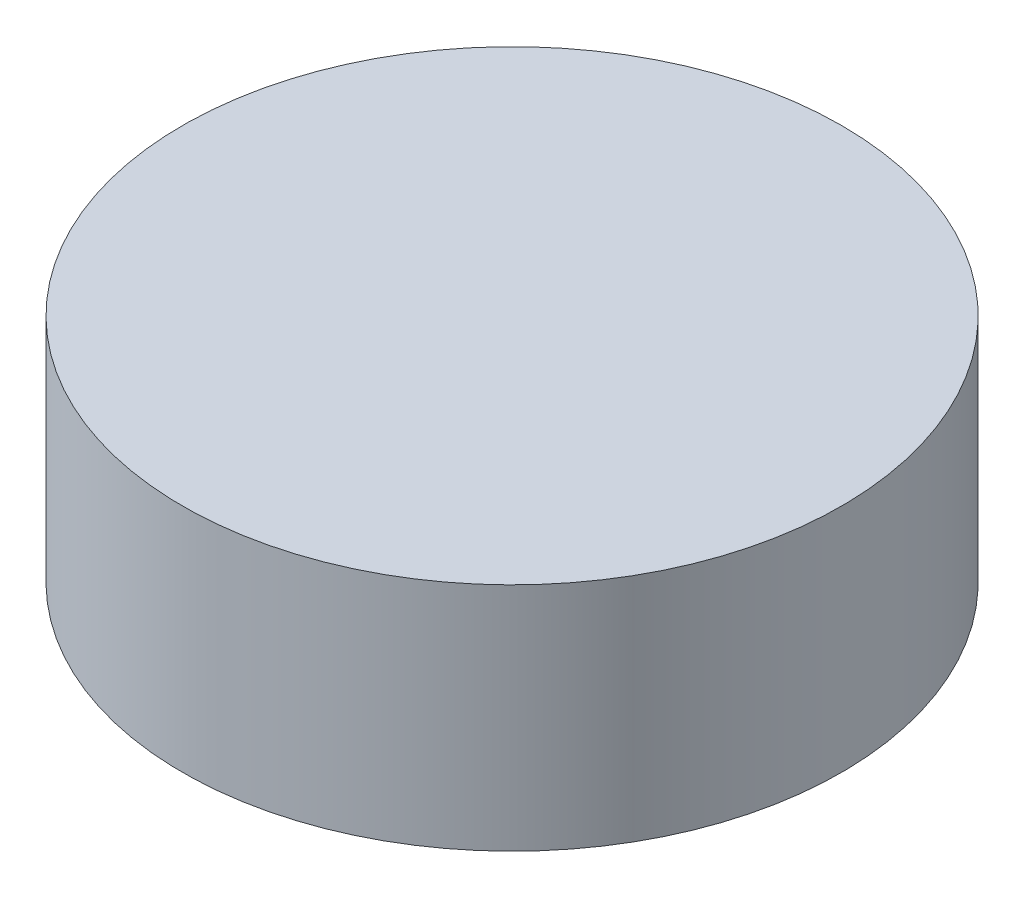
ISO-10303-21;
HEADER;
FILE_DESCRIPTION(('STEP AP214'),'2;1');
FILE_NAME('part.step','',(''),(''),'','','');
FILE_SCHEMA(('AUTOMOTIVE_DESIGN { 1 0 10303 214 1 1 1 1 }'));
ENDSEC;
DATA;
#1=APPLICATION_CONTEXT('core data for automotive mechanical design processes');
#2=APPLICATION_PROTOCOL_DEFINITION('international standard','automotive_design',2000,#1);
#3=PRODUCT_CONTEXT('',#1,'mechanical');
#4=PRODUCT('Part','Part','',(#3));
#5=PRODUCT_RELATED_PRODUCT_CATEGORY('part','',(#4));
#6=PRODUCT_DEFINITION_FORMATION('','',#4);
#7=PRODUCT_DEFINITION_CONTEXT('part definition',#1,'design');
#8=PRODUCT_DEFINITION('design','',#6,#7);
#9=PRODUCT_DEFINITION_SHAPE('','',#8);
#10=(LENGTH_UNIT() NAMED_UNIT(*) SI_UNIT(.MILLI.,.METRE.));
#11=(NAMED_UNIT(*) PLANE_ANGLE_UNIT() SI_UNIT($,.RADIAN.));
#12=(NAMED_UNIT(*) SI_UNIT($,.STERADIAN.) SOLID_ANGLE_UNIT());
#13=UNCERTAINTY_MEASURE_WITH_UNIT(LENGTH_MEASURE(1.E-05),#10,'distance_accuracy_value','');
#14=(GEOMETRIC_REPRESENTATION_CONTEXT(3) GLOBAL_UNCERTAINTY_ASSIGNED_CONTEXT((#13)) GLOBAL_UNIT_ASSIGNED_CONTEXT((#10,
#11,#12)) REPRESENTATION_CONTEXT('',''));
#15=CARTESIAN_POINT('',(0.,0.,0.));
#16=DIRECTION('',(0.,0.,1.));
#17=DIRECTION('',(1.,0.,0.));
#18=AXIS2_PLACEMENT_3D('',#15,#16,#17);
#19=CARTESIAN_POINT('',(-75.0000000000005,32.,129.903810567665));
#20=DIRECTION('',(0.,-1.,0.));
#21=DIRECTION('',(0.,0.,-1.));
#22=AXIS2_PLACEMENT_3D('',#19,#20,#21);
#23=CYLINDRICAL_SURFACE('',#22,20.);
#24=CARTESIAN_POINT('',(-75.0000000000005,32.,129.903810567665));
#25=DIRECTION('',(0.,1.,0.));
#26=DIRECTION('',(0.,0.,1.));
#27=AXIS2_PLACEMENT_3D('',#24,#25,#26);
#28=CIRCLE('',#27,20.);
#29=CARTESIAN_POINT('',(-75.0000000000005,32.,109.903810567665));
#30=VERTEX_POINT('',#29);
#31=EDGE_CURVE('E10',#30,#30,#28,.T.);
#32=CARTESIAN_POINT('',(-75.0000000000005,18.,129.903810567665));
#33=DIRECTION('',(0.,1.,0.));
#34=DIRECTION('',(0.,0.,1.));
#35=AXIS2_PLACEMENT_3D('',#32,#33,#34);
#36=CIRCLE('',#35,20.);
#37=CARTESIAN_POINT('',(-75.0000000000005,18.,109.903810567665));
#38=VERTEX_POINT('',#37);
#39=EDGE_CURVE('E40',#38,#38,#36,.T.);
#40=CARTESIAN_POINT('',(-75.0000000000005,32.,109.903810567665));
#41=CARTESIAN_POINT('',(-75.0000000000005,31.8541666666667,109.903810567665));
#42=CARTESIAN_POINT('',(-75.0000000000005,31.7083333333333,109.903810567665));
#43=CARTESIAN_POINT('',(-75.0000000000005,31.4166666666667,109.903810567665));
#44=CARTESIAN_POINT('',(-75.0000000000005,31.2708333333333,109.903810567665));
#45=CARTESIAN_POINT('',(-75.0000000000005,30.9791666666667,109.903810567665));
#46=CARTESIAN_POINT('',(-75.0000000000005,30.8333333333333,109.903810567665));
#47=CARTESIAN_POINT('',(-75.0000000000005,30.5416666666667,109.903810567665));
#48=CARTESIAN_POINT('',(-75.0000000000005,30.3958333333333,109.903810567665));
#49=CARTESIAN_POINT('',(-75.0000000000005,30.1041666666667,109.903810567665));
#50=CARTESIAN_POINT('',(-75.0000000000005,29.9583333333333,109.903810567665));
#51=CARTESIAN_POINT('',(-75.0000000000005,29.6666666666667,109.903810567665));
#52=CARTESIAN_POINT('',(-75.0000000000005,29.5208333333333,109.903810567665));
#53=CARTESIAN_POINT('',(-75.0000000000005,29.2291666666667,109.903810567665));
#54=CARTESIAN_POINT('',(-75.0000000000005,29.0833333333333,109.903810567665));
#55=CARTESIAN_POINT('',(-75.0000000000005,28.7916666666667,109.903810567665));
#56=CARTESIAN_POINT('',(-75.0000000000005,28.6458333333333,109.903810567665));
#57=CARTESIAN_POINT('',(-75.0000000000005,28.3541666666667,109.903810567665));
#58=CARTESIAN_POINT('',(-75.0000000000005,28.2083333333333,109.903810567665));
#59=CARTESIAN_POINT('',(-75.0000000000005,27.9166666666667,109.903810567665));
#60=CARTESIAN_POINT('',(-75.0000000000005,27.7708333333333,109.903810567665));
#61=CARTESIAN_POINT('',(-75.0000000000005,27.4791666666667,109.903810567665));
#62=CARTESIAN_POINT('',(-75.0000000000005,27.3333333333333,109.903810567665));
#63=CARTESIAN_POINT('',(-75.0000000000005,27.0416666666667,109.903810567665));
#64=CARTESIAN_POINT('',(-75.0000000000005,26.8958333333333,109.903810567665));
#65=CARTESIAN_POINT('',(-75.0000000000005,26.6041666666667,109.903810567665));
#66=CARTESIAN_POINT('',(-75.0000000000005,26.4583333333333,109.903810567665));
#67=CARTESIAN_POINT('',(-75.0000000000005,26.1666666666667,109.903810567665));
#68=CARTESIAN_POINT('',(-75.0000000000005,26.0208333333333,109.903810567665));
#69=CARTESIAN_POINT('',(-75.0000000000005,25.7291666666667,109.903810567665));
#70=CARTESIAN_POINT('',(-75.0000000000005,25.5833333333333,109.903810567665));
#71=CARTESIAN_POINT('',(-75.0000000000005,25.2916666666667,109.903810567665));
#72=CARTESIAN_POINT('',(-75.0000000000005,25.1458333333333,109.903810567665));
#73=CARTESIAN_POINT('',(-75.0000000000005,24.8541666666667,109.903810567665));
#74=CARTESIAN_POINT('',(-75.0000000000005,24.7083333333333,109.903810567665));
#75=CARTESIAN_POINT('',(-75.0000000000005,24.4166666666667,109.903810567665));
#76=CARTESIAN_POINT('',(-75.0000000000005,24.2708333333333,109.903810567665));
#77=CARTESIAN_POINT('',(-75.0000000000005,23.9791666666667,109.903810567665));
#78=CARTESIAN_POINT('',(-75.0000000000005,23.8333333333333,109.903810567665));
#79=CARTESIAN_POINT('',(-75.0000000000005,23.5416666666667,109.903810567665));
#80=CARTESIAN_POINT('',(-75.0000000000005,23.3958333333333,109.903810567665));
#81=CARTESIAN_POINT('',(-75.0000000000005,23.1041666666667,109.903810567665));
#82=CARTESIAN_POINT('',(-75.0000000000005,22.9583333333333,109.903810567665));
#83=CARTESIAN_POINT('',(-75.0000000000005,22.6666666666667,109.903810567665));
#84=CARTESIAN_POINT('',(-75.0000000000005,22.5208333333333,109.903810567665));
#85=CARTESIAN_POINT('',(-75.0000000000005,22.2291666666667,109.903810567665));
#86=CARTESIAN_POINT('',(-75.0000000000005,22.0833333333333,109.903810567665));
#87=CARTESIAN_POINT('',(-75.0000000000005,21.7916666666667,109.903810567665));
#88=CARTESIAN_POINT('',(-75.0000000000005,21.6458333333333,109.903810567665));
#89=CARTESIAN_POINT('',(-75.0000000000005,21.3541666666667,109.903810567665));
#90=CARTESIAN_POINT('',(-75.0000000000005,21.2083333333333,109.903810567665));
#91=CARTESIAN_POINT('',(-75.0000000000005,20.9166666666667,109.903810567665));
#92=CARTESIAN_POINT('',(-75.0000000000005,20.7708333333333,109.903810567665));
#93=CARTESIAN_POINT('',(-75.0000000000005,20.4791666666667,109.903810567665));
#94=CARTESIAN_POINT('',(-75.0000000000005,20.3333333333333,109.903810567665));
#95=CARTESIAN_POINT('',(-75.0000000000005,20.0416666666667,109.903810567665));
#96=CARTESIAN_POINT('',(-75.0000000000005,19.8958333333333,109.903810567665));
#97=CARTESIAN_POINT('',(-75.0000000000005,19.6041666666667,109.903810567665));
#98=CARTESIAN_POINT('',(-75.0000000000005,19.4583333333333,109.903810567665));
#99=CARTESIAN_POINT('',(-75.0000000000005,19.1666666666667,109.903810567665));
#100=CARTESIAN_POINT('',(-75.0000000000005,19.0208333333333,109.903810567665));
#101=CARTESIAN_POINT('',(-75.0000000000005,18.7291666666667,109.903810567665));
#102=CARTESIAN_POINT('',(-75.0000000000005,18.5833333333333,109.903810567665));
#103=CARTESIAN_POINT('',(-75.0000000000005,18.2916666666667,109.903810567665));
#104=CARTESIAN_POINT('',(-75.0000000000005,18.1458333333333,109.903810567665));
#105=CARTESIAN_POINT('',(-75.0000000000005,18.,109.903810567665));
#106=B_SPLINE_CURVE_WITH_KNOTS('',3,(#40,#41,#42,#43,#44,#45,#46,#47,#48,#49,#50,#51,#52,#53,
#54,#55,#56,#57,#58,#59,#60,#61,#62,#63,#64,#65,#66,#67,#68,#69,#70,#71,#72,#73,#74,#75,#76,#77,
#78,#79,#80,#81,#82,#83,#84,#85,#86,#87,#88,#89,#90,#91,#92,#93,#94,#95,#96,#97,#98,#99,#100,
#101,#102,#103,#104,#105),.UNSPECIFIED.,.F.,.F.,(4,2,2,2,2,2,2,2,2,2,2,2,2,2,2,2,2,2,2,2,2,2,2,
2,2,2,2,2,2,2,2,2,4),(0.,0.4375,0.875000000000004,1.3125,1.75,2.1875,2.625,3.0625,3.5,3.9375,
4.375,4.8125,5.25,5.6875,6.125,6.5625,7.,7.4375,7.875,8.3125,8.75,9.1875,9.625,10.0625,10.5,
10.9375,11.375,11.8125,12.25,12.6875,13.125,13.5625,14.),.UNSPECIFIED.);
#107=EDGE_CURVE('BSEAM37',#30,#38,#106,.T.);
#108=ORIENTED_EDGE('',*,*,#31,.F.);
#109=ORIENTED_EDGE('',*,*,#39,.T.);
#110=ORIENTED_EDGE('',*,*,#107,.T.);
#111=ORIENTED_EDGE('',*,*,#107,.F.);
#112=EDGE_LOOP('',(#108,#110,#109,#111));
#113=FACE_BOUND('',#112,.T.);
#114=ADVANCED_FACE('F37',(#113),#23,.T.);
#115=CARTESIAN_POINT('',(-75.0000000000005,32.,129.903810567665));
#116=DIRECTION('',(0.,1.,0.));
#117=DIRECTION('',(0.,0.,1.));
#118=AXIS2_PLACEMENT_3D('',#115,#116,#117);
#119=PLANE('',#118);
#120=ORIENTED_EDGE('',*,*,#31,.T.);
#121=EDGE_LOOP('',(#120));
#122=FACE_BOUND('',#121,.T.);
#123=ADVANCED_FACE('F54',(#122),#119,.T.);
#124=CARTESIAN_POINT('',(-75.0000000000005,18.,129.903810567665));
#125=DIRECTION('',(0.,1.,0.));
#126=DIRECTION('',(0.,0.,1.));
#127=AXIS2_PLACEMENT_3D('',#124,#125,#126);
#128=PLANE('',#127);
#129=ORIENTED_EDGE('',*,*,#39,.F.);
#130=EDGE_LOOP('',(#129));
#131=FACE_BOUND('',#130,.T.);
#132=ADVANCED_FACE('F52',(#131),#128,.F.);
#133=CLOSED_SHELL('',(#114,#123,#132));
#134=MANIFOLD_SOLID_BREP('B2',#133);
#135=ADVANCED_BREP_SHAPE_REPRESENTATION('',(#18,#134),#14);
#136=SHAPE_DEFINITION_REPRESENTATION(#9,#135);
ENDSEC;
END-ISO-10303-21;
